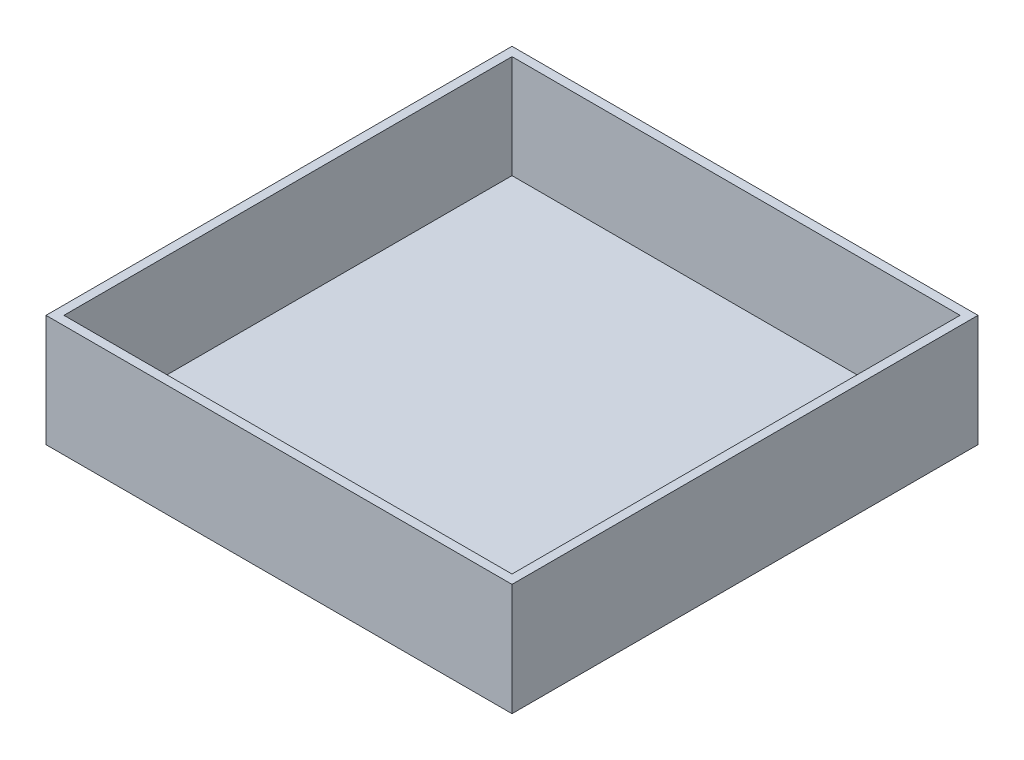
ISO-10303-21;
HEADER;
FILE_DESCRIPTION(('STEP AP214'),'2;1');
FILE_NAME('part.step','',(''),(''),'','','');
FILE_SCHEMA(('AUTOMOTIVE_DESIGN { 1 0 10303 214 1 1 1 1 }'));
ENDSEC;
DATA;
#1=APPLICATION_CONTEXT('core data for automotive mechanical design processes');
#2=APPLICATION_PROTOCOL_DEFINITION('international standard','automotive_design',2000,#1);
#3=PRODUCT_CONTEXT('',#1,'mechanical');
#4=PRODUCT('Part','Part','',(#3));
#5=PRODUCT_RELATED_PRODUCT_CATEGORY('part','',(#4));
#6=PRODUCT_DEFINITION_FORMATION('','',#4);
#7=PRODUCT_DEFINITION_CONTEXT('part definition',#1,'design');
#8=PRODUCT_DEFINITION('design','',#6,#7);
#9=PRODUCT_DEFINITION_SHAPE('','',#8);
#10=(LENGTH_UNIT() NAMED_UNIT(*) SI_UNIT(.MILLI.,.METRE.));
#11=(NAMED_UNIT(*) PLANE_ANGLE_UNIT() SI_UNIT($,.RADIAN.));
#12=(NAMED_UNIT(*) SI_UNIT($,.STERADIAN.) SOLID_ANGLE_UNIT());
#13=UNCERTAINTY_MEASURE_WITH_UNIT(LENGTH_MEASURE(1.E-05),#10,'distance_accuracy_value','');
#14=(GEOMETRIC_REPRESENTATION_CONTEXT(3) GLOBAL_UNCERTAINTY_ASSIGNED_CONTEXT((#13)) GLOBAL_UNIT_ASSIGNED_CONTEXT((#10,
#11,#12)) REPRESENTATION_CONTEXT('',''));
#15=CARTESIAN_POINT('',(0.,0.,0.));
#16=DIRECTION('',(0.,0.,1.));
#17=DIRECTION('',(1.,0.,0.));
#18=AXIS2_PLACEMENT_3D('',#15,#16,#17);
#19=CARTESIAN_POINT('',(0.,125.,0.));
#20=DIRECTION('',(0.,-1.,0.));
#21=DIRECTION('',(0.,0.,-1.));
#22=AXIS2_PLACEMENT_3D('',#19,#20,#21);
#23=PLANE('',#22);
#24=DIRECTION('',(0.,0.,-1.));
#25=VECTOR('',#24,1.);
#26=CARTESIAN_POINT('',(260.,125.,260.));
#27=LINE('',#26,#25);
#28=CARTESIAN_POINT('',(260.,125.,260.));
#29=VERTEX_POINT('',#28);
#30=CARTESIAN_POINT('',(260.,125.,-260.));
#31=VERTEX_POINT('',#30);
#32=EDGE_CURVE('E163',#29,#31,#27,.T.);
#33=ORIENTED_EDGE('',*,*,#32,.T.);
#34=DIRECTION('',(-1.,0.,0.));
#35=VECTOR('',#34,1.);
#36=CARTESIAN_POINT('',(-260.,125.,-260.));
#37=LINE('',#36,#35);
#38=CARTESIAN_POINT('',(-260.,125.,-260.));
#39=VERTEX_POINT('',#38);
#40=EDGE_CURVE('E98',#31,#39,#37,.T.);
#41=ORIENTED_EDGE('',*,*,#40,.T.);
#42=DIRECTION('',(0.,0.,1.));
#43=VECTOR('',#42,1.);
#44=CARTESIAN_POINT('',(-260.,125.,260.));
#45=LINE('',#44,#43);
#46=CARTESIAN_POINT('',(-260.,125.,260.));
#47=VERTEX_POINT('',#46);
#48=EDGE_CURVE('E168',#39,#47,#45,.T.);
#49=ORIENTED_EDGE('',*,*,#48,.T.);
#50=DIRECTION('',(1.,0.,0.));
#51=VECTOR('',#50,1.);
#52=CARTESIAN_POINT('',(-260.,125.,260.));
#53=LINE('',#52,#51);
#54=EDGE_CURVE('E70',#47,#29,#53,.T.);
#55=ORIENTED_EDGE('',*,*,#54,.T.);
#56=EDGE_LOOP('',(#33,#41,#49,#55));
#57=FACE_BOUND('',#56,.T.);
#58=DIRECTION('',(0.,0.,-1.));
#59=VECTOR('',#58,1.);
#60=CARTESIAN_POINT('',(250.,125.,0.));
#61=LINE('',#60,#59);
#62=CARTESIAN_POINT('',(250.,125.,250.));
#63=VERTEX_POINT('',#62);
#64=CARTESIAN_POINT('',(250.,125.,-250.));
#65=VERTEX_POINT('',#64);
#66=EDGE_CURVE('E147',#63,#65,#61,.T.);
#67=ORIENTED_EDGE('',*,*,#66,.F.);
#68=DIRECTION('',(1.,0.,0.));
#69=VECTOR('',#68,1.);
#70=CARTESIAN_POINT('',(0.,125.,250.));
#71=LINE('',#70,#69);
#72=CARTESIAN_POINT('',(-250.,125.,250.));
#73=VERTEX_POINT('',#72);
#74=EDGE_CURVE('E160',#73,#63,#71,.T.);
#75=ORIENTED_EDGE('',*,*,#74,.F.);
#76=DIRECTION('',(0.,0.,1.));
#77=VECTOR('',#76,1.);
#78=CARTESIAN_POINT('',(-250.,125.,0.));
#79=LINE('',#78,#77);
#80=CARTESIAN_POINT('',(-250.,125.,-250.));
#81=VERTEX_POINT('',#80);
#82=EDGE_CURVE('E157',#81,#73,#79,.T.);
#83=ORIENTED_EDGE('',*,*,#82,.F.);
#84=DIRECTION('',(-1.,0.,0.));
#85=VECTOR('',#84,1.);
#86=CARTESIAN_POINT('',(0.,125.,-250.));
#87=LINE('',#86,#85);
#88=EDGE_CURVE('E136',#65,#81,#87,.T.);
#89=ORIENTED_EDGE('',*,*,#88,.F.);
#90=EDGE_LOOP('',(#67,#75,#83,#89));
#91=FACE_BOUND('',#90,.T.);
#92=ADVANCED_FACE('F45',(#57,#91),#23,.F.);
#93=CARTESIAN_POINT('',(260.,125.,260.));
#94=DIRECTION('',(-1.,0.,0.));
#95=DIRECTION('',(0.,0.,1.));
#96=AXIS2_PLACEMENT_3D('',#93,#94,#95);
#97=PLANE('',#96);
#98=DIRECTION('',(0.,0.,-1.));
#99=VECTOR('',#98,1.);
#100=CARTESIAN_POINT('',(260.,0.,260.));
#101=LINE('',#100,#99);
#102=CARTESIAN_POINT('',(260.,0.,260.));
#103=VERTEX_POINT('',#102);
#104=CARTESIAN_POINT('',(260.,0.,-260.));
#105=VERTEX_POINT('',#104);
#106=EDGE_CURVE('E174',#103,#105,#101,.T.);
#107=ORIENTED_EDGE('',*,*,#106,.T.);
#108=DIRECTION('',(0.,-1.,0.));
#109=VECTOR('',#108,1.);
#110=CARTESIAN_POINT('',(260.,125.,-260.));
#111=LINE('',#110,#109);
#112=EDGE_CURVE('E11',#31,#105,#111,.T.);
#113=ORIENTED_EDGE('',*,*,#112,.F.);
#114=ORIENTED_EDGE('',*,*,#32,.F.);
#115=DIRECTION('',(0.,-1.,0.));
#116=VECTOR('',#115,1.);
#117=CARTESIAN_POINT('',(260.,125.,260.));
#118=LINE('',#117,#116);
#119=EDGE_CURVE('E173',#29,#103,#118,.T.);
#120=ORIENTED_EDGE('',*,*,#119,.T.);
#121=EDGE_LOOP('',(#107,#113,#114,#120));
#122=FACE_BOUND('',#121,.T.);
#123=ADVANCED_FACE('F47',(#122),#97,.F.);
#124=CARTESIAN_POINT('',(-260.,125.,-260.));
#125=DIRECTION('',(0.,0.,1.));
#126=DIRECTION('',(1.,0.,0.));
#127=AXIS2_PLACEMENT_3D('',#124,#125,#126);
#128=PLANE('',#127);
#129=DIRECTION('',(-1.,0.,0.));
#130=VECTOR('',#129,1.);
#131=CARTESIAN_POINT('',(-260.,0.,-260.));
#132=LINE('',#131,#130);
#133=CARTESIAN_POINT('',(-260.,0.,-260.));
#134=VERTEX_POINT('',#133);
#135=EDGE_CURVE('E178',#105,#134,#132,.T.);
#136=ORIENTED_EDGE('',*,*,#135,.T.);
#137=DIRECTION('',(0.,-1.,0.));
#138=VECTOR('',#137,1.);
#139=CARTESIAN_POINT('',(-260.,125.,-260.));
#140=LINE('',#139,#138);
#141=EDGE_CURVE('E54',#39,#134,#140,.T.);
#142=ORIENTED_EDGE('',*,*,#141,.F.);
#143=ORIENTED_EDGE('',*,*,#40,.F.);
#144=ORIENTED_EDGE('',*,*,#112,.T.);
#145=EDGE_LOOP('',(#136,#142,#143,#144));
#146=FACE_BOUND('',#145,.T.);
#147=ADVANCED_FACE('F212',(#146),#128,.F.);
#148=CARTESIAN_POINT('',(-260.,125.,260.));
#149=DIRECTION('',(1.,0.,0.));
#150=DIRECTION('',(0.,0.,-1.));
#151=AXIS2_PLACEMENT_3D('',#148,#149,#150);
#152=PLANE('',#151);
#153=DIRECTION('',(0.,0.,1.));
#154=VECTOR('',#153,1.);
#155=CARTESIAN_POINT('',(-260.,0.,260.));
#156=LINE('',#155,#154);
#157=CARTESIAN_POINT('',(-260.,0.,260.));
#158=VERTEX_POINT('',#157);
#159=EDGE_CURVE('E181',#134,#158,#156,.T.);
#160=ORIENTED_EDGE('',*,*,#159,.T.);
#161=DIRECTION('',(0.,-1.,0.));
#162=VECTOR('',#161,1.);
#163=CARTESIAN_POINT('',(-260.,125.,260.));
#164=LINE('',#163,#162);
#165=EDGE_CURVE('E188',#47,#158,#164,.T.);
#166=ORIENTED_EDGE('',*,*,#165,.F.);
#167=ORIENTED_EDGE('',*,*,#48,.F.);
#168=ORIENTED_EDGE('',*,*,#141,.T.);
#169=EDGE_LOOP('',(#160,#166,#167,#168));
#170=FACE_BOUND('',#169,.T.);
#171=ADVANCED_FACE('F195',(#170),#152,.F.);
#172=CARTESIAN_POINT('',(-260.,125.,260.));
#173=DIRECTION('',(0.,0.,-1.));
#174=DIRECTION('',(-1.,0.,0.));
#175=AXIS2_PLACEMENT_3D('',#172,#173,#174);
#176=PLANE('',#175);
#177=DIRECTION('',(1.,0.,0.));
#178=VECTOR('',#177,1.);
#179=CARTESIAN_POINT('',(-260.,0.,260.));
#180=LINE('',#179,#178);
#181=EDGE_CURVE('E91',#158,#103,#180,.T.);
#182=ORIENTED_EDGE('',*,*,#181,.T.);
#183=ORIENTED_EDGE('',*,*,#119,.F.);
#184=ORIENTED_EDGE('',*,*,#54,.F.);
#185=ORIENTED_EDGE('',*,*,#165,.T.);
#186=EDGE_LOOP('',(#182,#183,#184,#185));
#187=FACE_BOUND('',#186,.T.);
#188=ADVANCED_FACE('F203',(#187),#176,.F.);
#189=CARTESIAN_POINT('',(0.,0.,0.));
#190=DIRECTION('',(0.,-1.,0.));
#191=DIRECTION('',(0.,0.,-1.));
#192=AXIS2_PLACEMENT_3D('',#189,#190,#191);
#193=PLANE('',#192);
#194=ORIENTED_EDGE('',*,*,#106,.F.);
#195=ORIENTED_EDGE('',*,*,#181,.F.);
#196=ORIENTED_EDGE('',*,*,#159,.F.);
#197=ORIENTED_EDGE('',*,*,#135,.F.);
#198=EDGE_LOOP('',(#194,#195,#196,#197));
#199=FACE_BOUND('',#198,.T.);
#200=ADVANCED_FACE('F199',(#199),#193,.T.);
#201=CARTESIAN_POINT('',(250.,125.,260.));
#202=DIRECTION('',(-1.,0.,0.));
#203=DIRECTION('',(0.,0.,1.));
#204=AXIS2_PLACEMENT_3D('',#201,#202,#203);
#205=PLANE('',#204);
#206=DIRECTION('',(0.,0.,-1.));
#207=VECTOR('',#206,1.);
#208=CARTESIAN_POINT('',(250.,10.,0.));
#209=LINE('',#208,#207);
#210=CARTESIAN_POINT('',(250.,10.,250.));
#211=VERTEX_POINT('',#210);
#212=CARTESIAN_POINT('',(250.,10.,-250.));
#213=VERTEX_POINT('',#212);
#214=EDGE_CURVE('E126',#211,#213,#209,.T.);
#215=ORIENTED_EDGE('',*,*,#214,.F.);
#216=DIRECTION('',(0.,-1.,0.));
#217=VECTOR('',#216,1.);
#218=CARTESIAN_POINT('',(250.,125.,250.));
#219=LINE('',#218,#217);
#220=EDGE_CURVE('E151',#63,#211,#219,.T.);
#221=ORIENTED_EDGE('',*,*,#220,.F.);
#222=ORIENTED_EDGE('',*,*,#66,.T.);
#223=DIRECTION('',(0.,-1.,0.));
#224=VECTOR('',#223,1.);
#225=CARTESIAN_POINT('',(250.,125.,-250.));
#226=LINE('',#225,#224);
#227=EDGE_CURVE('E140',#65,#213,#226,.T.);
#228=ORIENTED_EDGE('',*,*,#227,.T.);
#229=EDGE_LOOP('',(#215,#221,#222,#228));
#230=FACE_BOUND('',#229,.T.);
#231=ADVANCED_FACE('F210',(#230),#205,.T.);
#232=CARTESIAN_POINT('',(-260.,125.,-250.));
#233=DIRECTION('',(0.,0.,1.));
#234=DIRECTION('',(1.,0.,0.));
#235=AXIS2_PLACEMENT_3D('',#232,#233,#234);
#236=PLANE('',#235);
#237=DIRECTION('',(-1.,0.,0.));
#238=VECTOR('',#237,1.);
#239=CARTESIAN_POINT('',(0.,10.,-250.));
#240=LINE('',#239,#238);
#241=CARTESIAN_POINT('',(-250.,10.,-250.));
#242=VERTEX_POINT('',#241);
#243=EDGE_CURVE('E120',#213,#242,#240,.T.);
#244=ORIENTED_EDGE('',*,*,#243,.F.);
#245=ORIENTED_EDGE('',*,*,#227,.F.);
#246=ORIENTED_EDGE('',*,*,#88,.T.);
#247=DIRECTION('',(0.,-1.,0.));
#248=VECTOR('',#247,1.);
#249=CARTESIAN_POINT('',(-250.,125.,-250.));
#250=LINE('',#249,#248);
#251=EDGE_CURVE('E133',#81,#242,#250,.T.);
#252=ORIENTED_EDGE('',*,*,#251,.T.);
#253=EDGE_LOOP('',(#244,#245,#246,#252));
#254=FACE_BOUND('',#253,.T.);
#255=ADVANCED_FACE('F134',(#254),#236,.T.);
#256=CARTESIAN_POINT('',(-250.,125.,260.));
#257=DIRECTION('',(1.,0.,0.));
#258=DIRECTION('',(0.,0.,-1.));
#259=AXIS2_PLACEMENT_3D('',#256,#257,#258);
#260=PLANE('',#259);
#261=DIRECTION('',(0.,0.,1.));
#262=VECTOR('',#261,1.);
#263=CARTESIAN_POINT('',(-250.,10.,0.));
#264=LINE('',#263,#262);
#265=CARTESIAN_POINT('',(-250.,10.,250.));
#266=VERTEX_POINT('',#265);
#267=EDGE_CURVE('E124',#242,#266,#264,.T.);
#268=ORIENTED_EDGE('',*,*,#267,.F.);
#269=ORIENTED_EDGE('',*,*,#251,.F.);
#270=ORIENTED_EDGE('',*,*,#82,.T.);
#271=DIRECTION('',(0.,-1.,0.));
#272=VECTOR('',#271,1.);
#273=CARTESIAN_POINT('',(-250.,125.,250.));
#274=LINE('',#273,#272);
#275=EDGE_CURVE('E61',#73,#266,#274,.T.);
#276=ORIENTED_EDGE('',*,*,#275,.T.);
#277=EDGE_LOOP('',(#268,#269,#270,#276));
#278=FACE_BOUND('',#277,.T.);
#279=ADVANCED_FACE('F142',(#278),#260,.T.);
#280=CARTESIAN_POINT('',(-260.,125.,250.));
#281=DIRECTION('',(0.,0.,-1.));
#282=DIRECTION('',(-1.,0.,0.));
#283=AXIS2_PLACEMENT_3D('',#280,#281,#282);
#284=PLANE('',#283);
#285=DIRECTION('',(1.,0.,0.));
#286=VECTOR('',#285,1.);
#287=CARTESIAN_POINT('',(0.,10.,250.));
#288=LINE('',#287,#286);
#289=EDGE_CURVE('E144',#266,#211,#288,.T.);
#290=ORIENTED_EDGE('',*,*,#289,.F.);
#291=ORIENTED_EDGE('',*,*,#275,.F.);
#292=ORIENTED_EDGE('',*,*,#74,.T.);
#293=ORIENTED_EDGE('',*,*,#220,.T.);
#294=EDGE_LOOP('',(#290,#291,#292,#293));
#295=FACE_BOUND('',#294,.T.);
#296=ADVANCED_FACE('F224',(#295),#284,.T.);
#297=CARTESIAN_POINT('',(0.,10.,0.));
#298=DIRECTION('',(0.,-1.,0.));
#299=DIRECTION('',(0.,0.,-1.));
#300=AXIS2_PLACEMENT_3D('',#297,#298,#299);
#301=PLANE('',#300);
#302=ORIENTED_EDGE('',*,*,#214,.T.);
#303=ORIENTED_EDGE('',*,*,#243,.T.);
#304=ORIENTED_EDGE('',*,*,#267,.T.);
#305=ORIENTED_EDGE('',*,*,#289,.T.);
#306=EDGE_LOOP('',(#302,#303,#304,#305));
#307=FACE_BOUND('',#306,.T.);
#308=ADVANCED_FACE('F122',(#307),#301,.F.);
#309=CLOSED_SHELL('',(#92,#123,#147,#171,#188,#200,#231,#255,#279,#296,#308));
#310=MANIFOLD_SOLID_BREP('B2',#309);
#311=ADVANCED_BREP_SHAPE_REPRESENTATION('',(#18,#310),#14);
#312=SHAPE_DEFINITION_REPRESENTATION(#9,#311);
ENDSEC;
END-ISO-10303-21;
